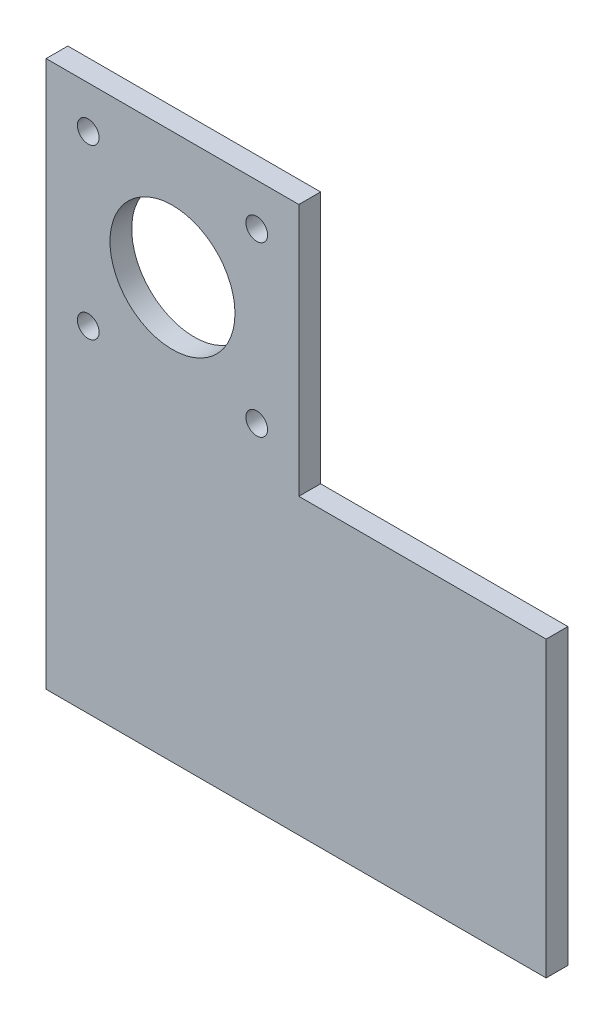
ISO-10303-21;
HEADER;
FILE_DESCRIPTION(('STEP AP214'),'2;1');
FILE_NAME('part.step','',(''),(''),'','','');
FILE_SCHEMA(('AUTOMOTIVE_DESIGN { 1 0 10303 214 1 1 1 1 }'));
ENDSEC;
DATA;
#1=APPLICATION_CONTEXT('core data for automotive mechanical design processes');
#2=APPLICATION_PROTOCOL_DEFINITION('international standard','automotive_design',2000,#1);
#3=PRODUCT_CONTEXT('',#1,'mechanical');
#4=PRODUCT('Part','Part','',(#3));
#5=PRODUCT_RELATED_PRODUCT_CATEGORY('part','',(#4));
#6=PRODUCT_DEFINITION_FORMATION('','',#4);
#7=PRODUCT_DEFINITION_CONTEXT('part definition',#1,'design');
#8=PRODUCT_DEFINITION('design','',#6,#7);
#9=PRODUCT_DEFINITION_SHAPE('','',#8);
#10=(LENGTH_UNIT() NAMED_UNIT(*) SI_UNIT(.MILLI.,.METRE.));
#11=(NAMED_UNIT(*) PLANE_ANGLE_UNIT() SI_UNIT($,.RADIAN.));
#12=(NAMED_UNIT(*) SI_UNIT($,.STERADIAN.) SOLID_ANGLE_UNIT());
#13=UNCERTAINTY_MEASURE_WITH_UNIT(LENGTH_MEASURE(1.E-05),#10,'distance_accuracy_value','');
#14=(GEOMETRIC_REPRESENTATION_CONTEXT(3) GLOBAL_UNCERTAINTY_ASSIGNED_CONTEXT((#13)) GLOBAL_UNIT_ASSIGNED_CONTEXT((#10,
#11,#12)) REPRESENTATION_CONTEXT('',''));
#15=CARTESIAN_POINT('',(0.,0.,0.));
#16=DIRECTION('',(0.,0.,1.));
#17=DIRECTION('',(1.,0.,0.));
#18=AXIS2_PLACEMENT_3D('',#15,#16,#17);
#19=CARTESIAN_POINT('',(0.,0.,4.));
#20=DIRECTION('',(0.,0.,-1.));
#21=DIRECTION('',(-1.,0.,0.));
#22=AXIS2_PLACEMENT_3D('',#19,#20,#21);
#23=PLANE('',#22);
#24=DIRECTION('',(1.,0.,0.));
#25=VECTOR('',#24,1.);
#26=CARTESIAN_POINT('',(92.,0.,4.));
#27=LINE('',#26,#25);
#28=CARTESIAN_POINT('',(0.,0.,4.));
#29=VERTEX_POINT('',#28);
#30=CARTESIAN_POINT('',(92.,0.,4.));
#31=VERTEX_POINT('',#30);
#32=EDGE_CURVE('E129',#29,#31,#27,.T.);
#33=ORIENTED_EDGE('',*,*,#32,.T.);
#34=DIRECTION('',(0.,1.,0.));
#35=VECTOR('',#34,1.);
#36=CARTESIAN_POINT('',(92.,54.,4.));
#37=LINE('',#36,#35);
#38=CARTESIAN_POINT('',(92.,54.,4.));
#39=VERTEX_POINT('',#38);
#40=EDGE_CURVE('E87',#31,#39,#37,.T.);
#41=ORIENTED_EDGE('',*,*,#40,.T.);
#42=DIRECTION('',(-1.,0.,0.));
#43=VECTOR('',#42,1.);
#44=CARTESIAN_POINT('',(46.5,54.,4.));
#45=LINE('',#44,#43);
#46=CARTESIAN_POINT('',(46.5,54.,4.));
#47=VERTEX_POINT('',#46);
#48=EDGE_CURVE('E100',#39,#47,#45,.T.);
#49=ORIENTED_EDGE('',*,*,#48,.T.);
#50=DIRECTION('',(0.,1.,0.));
#51=VECTOR('',#50,1.);
#52=CARTESIAN_POINT('',(46.5,100.5,4.));
#53=LINE('',#52,#51);
#54=CARTESIAN_POINT('',(46.5,100.5,4.));
#55=VERTEX_POINT('',#54);
#56=EDGE_CURVE('E94',#47,#55,#53,.T.);
#57=ORIENTED_EDGE('',*,*,#56,.T.);
#58=DIRECTION('',(-1.,0.,0.));
#59=VECTOR('',#58,1.);
#60=CARTESIAN_POINT('',(0.,100.5,4.));
#61=LINE('',#60,#59);
#62=CARTESIAN_POINT('',(0.,100.5,4.));
#63=VERTEX_POINT('',#62);
#64=EDGE_CURVE('E98',#55,#63,#61,.T.);
#65=ORIENTED_EDGE('',*,*,#64,.T.);
#66=DIRECTION('',(0.,-1.,0.));
#67=VECTOR('',#66,1.);
#68=CARTESIAN_POINT('',(0.,0.,4.));
#69=LINE('',#68,#67);
#70=EDGE_CURVE('E50',#63,#29,#69,.T.);
#71=ORIENTED_EDGE('',*,*,#70,.T.);
#72=EDGE_LOOP('',(#33,#41,#49,#57,#65,#71));
#73=FACE_BOUND('',#72,.T.);
#74=CARTESIAN_POINT('',(23.25,77.25,4.));
#75=DIRECTION('',(0.,0.,1.));
#76=DIRECTION('',(1.,0.,0.));
#77=AXIS2_PLACEMENT_3D('',#74,#75,#76);
#78=CIRCLE('',#77,11.5);
#79=CARTESIAN_POINT('',(34.75,77.25,4.));
#80=VERTEX_POINT('',#79);
#81=EDGE_CURVE('E122',#80,#80,#78,.T.);
#82=ORIENTED_EDGE('',*,*,#81,.F.);
#83=EDGE_LOOP('',(#82));
#84=FACE_BOUND('',#83,.T.);
#85=CARTESIAN_POINT('',(7.75000185391281,92.7499981460872,4.));
#86=DIRECTION('',(0.,0.,1.));
#87=DIRECTION('',(1.,0.,0.));
#88=AXIS2_PLACEMENT_3D('',#85,#86,#87);
#89=CIRCLE('',#88,2.);
#90=CARTESIAN_POINT('',(9.75000185391281,92.7499981460872,4.));
#91=VERTEX_POINT('',#90);
#92=EDGE_CURVE('E203',#91,#91,#89,.T.);
#93=ORIENTED_EDGE('',*,*,#92,.F.);
#94=EDGE_LOOP('',(#93));
#95=FACE_BOUND('',#94,.T.);
#96=CARTESIAN_POINT('',(38.7500018539128,92.7500018539128,4.));
#97=DIRECTION('',(0.,0.,1.));
#98=DIRECTION('',(1.,0.,0.));
#99=AXIS2_PLACEMENT_3D('',#96,#97,#98);
#100=CIRCLE('',#99,2.);
#101=CARTESIAN_POINT('',(40.7500018539128,92.7500018539128,4.));
#102=VERTEX_POINT('',#101);
#103=EDGE_CURVE('E197',#102,#102,#100,.T.);
#104=ORIENTED_EDGE('',*,*,#103,.F.);
#105=EDGE_LOOP('',(#104));
#106=FACE_BOUND('',#105,.T.);
#107=CARTESIAN_POINT('',(38.7499981460872,61.7500018539128,4.));
#108=DIRECTION('',(0.,0.,1.));
#109=DIRECTION('',(1.,0.,0.));
#110=AXIS2_PLACEMENT_3D('',#107,#108,#109);
#111=CIRCLE('',#110,2.);
#112=CARTESIAN_POINT('',(40.7499981460872,61.7500018539128,4.));
#113=VERTEX_POINT('',#112);
#114=EDGE_CURVE('E191',#113,#113,#111,.T.);
#115=ORIENTED_EDGE('',*,*,#114,.F.);
#116=EDGE_LOOP('',(#115));
#117=FACE_BOUND('',#116,.T.);
#118=CARTESIAN_POINT('',(7.74999814608723,61.7499981460872,4.));
#119=DIRECTION('',(0.,0.,1.));
#120=DIRECTION('',(1.,0.,0.));
#121=AXIS2_PLACEMENT_3D('',#118,#119,#120);
#122=CIRCLE('',#121,2.);
#123=CARTESIAN_POINT('',(9.74999814608723,61.7499981460872,4.));
#124=VERTEX_POINT('',#123);
#125=EDGE_CURVE('E182',#124,#124,#122,.T.);
#126=ORIENTED_EDGE('',*,*,#125,.F.);
#127=EDGE_LOOP('',(#126));
#128=FACE_BOUND('',#127,.T.);
#129=ADVANCED_FACE('F33',(#73,#84,#95,#106,#117,#128),#23,.F.);
#130=CARTESIAN_POINT('',(0.,0.,0.));
#131=DIRECTION('',(0.,0.,-1.));
#132=DIRECTION('',(-1.,0.,0.));
#133=AXIS2_PLACEMENT_3D('',#130,#131,#132);
#134=PLANE('',#133);
#135=CARTESIAN_POINT('',(38.7499981460872,61.7500018539128,0.));
#136=DIRECTION('',(0.,0.,1.));
#137=DIRECTION('',(1.,0.,0.));
#138=AXIS2_PLACEMENT_3D('',#135,#136,#137);
#139=CIRCLE('',#138,2.);
#140=CARTESIAN_POINT('',(40.7499981460872,61.7500018539128,0.));
#141=VERTEX_POINT('',#140);
#142=EDGE_CURVE('E188',#141,#141,#139,.T.);
#143=ORIENTED_EDGE('',*,*,#142,.T.);
#144=EDGE_LOOP('',(#143));
#145=FACE_BOUND('',#144,.T.);
#146=CARTESIAN_POINT('',(7.75000185391281,92.7499981460872,0.));
#147=DIRECTION('',(0.,0.,1.));
#148=DIRECTION('',(1.,0.,0.));
#149=AXIS2_PLACEMENT_3D('',#146,#147,#148);
#150=CIRCLE('',#149,2.);
#151=CARTESIAN_POINT('',(9.75000185391281,92.7499981460872,0.));
#152=VERTEX_POINT('',#151);
#153=EDGE_CURVE('E200',#152,#152,#150,.T.);
#154=ORIENTED_EDGE('',*,*,#153,.T.);
#155=EDGE_LOOP('',(#154));
#156=FACE_BOUND('',#155,.T.);
#157=DIRECTION('',(1.,0.,0.));
#158=VECTOR('',#157,1.);
#159=CARTESIAN_POINT('',(92.,0.,0.));
#160=LINE('',#159,#158);
#161=CARTESIAN_POINT('',(0.,0.,0.));
#162=VERTEX_POINT('',#161);
#163=CARTESIAN_POINT('',(92.,0.,0.));
#164=VERTEX_POINT('',#163);
#165=EDGE_CURVE('E118',#162,#164,#160,.T.);
#166=ORIENTED_EDGE('',*,*,#165,.F.);
#167=DIRECTION('',(0.,-1.,0.));
#168=VECTOR('',#167,1.);
#169=CARTESIAN_POINT('',(0.,0.,0.));
#170=LINE('',#169,#168);
#171=CARTESIAN_POINT('',(0.,100.5,0.));
#172=VERTEX_POINT('',#171);
#173=EDGE_CURVE('E79',#172,#162,#170,.T.);
#174=ORIENTED_EDGE('',*,*,#173,.F.);
#175=DIRECTION('',(-1.,0.,0.));
#176=VECTOR('',#175,1.);
#177=CARTESIAN_POINT('',(0.,100.5,0.));
#178=LINE('',#177,#176);
#179=CARTESIAN_POINT('',(46.5,100.5,0.));
#180=VERTEX_POINT('',#179);
#181=EDGE_CURVE('E73',#180,#172,#178,.T.);
#182=ORIENTED_EDGE('',*,*,#181,.F.);
#183=DIRECTION('',(0.,1.,0.));
#184=VECTOR('',#183,1.);
#185=CARTESIAN_POINT('',(46.5,100.5,0.));
#186=LINE('',#185,#184);
#187=CARTESIAN_POINT('',(46.5,54.,0.));
#188=VERTEX_POINT('',#187);
#189=EDGE_CURVE('E108',#188,#180,#186,.T.);
#190=ORIENTED_EDGE('',*,*,#189,.F.);
#191=DIRECTION('',(-1.,0.,0.));
#192=VECTOR('',#191,1.);
#193=CARTESIAN_POINT('',(46.5,54.,0.));
#194=LINE('',#193,#192);
#195=CARTESIAN_POINT('',(92.,54.,0.));
#196=VERTEX_POINT('',#195);
#197=EDGE_CURVE('E124',#196,#188,#194,.T.);
#198=ORIENTED_EDGE('',*,*,#197,.F.);
#199=DIRECTION('',(0.,1.,0.));
#200=VECTOR('',#199,1.);
#201=CARTESIAN_POINT('',(92.,54.,0.));
#202=LINE('',#201,#200);
#203=EDGE_CURVE('E121',#164,#196,#202,.T.);
#204=ORIENTED_EDGE('',*,*,#203,.F.);
#205=EDGE_LOOP('',(#166,#174,#182,#190,#198,#204));
#206=FACE_BOUND('',#205,.T.);
#207=CARTESIAN_POINT('',(23.25,77.25,0.));
#208=DIRECTION('',(0.,0.,1.));
#209=DIRECTION('',(1.,0.,0.));
#210=AXIS2_PLACEMENT_3D('',#207,#208,#209);
#211=CIRCLE('',#210,11.5);
#212=CARTESIAN_POINT('',(34.75,77.25,0.));
#213=VERTEX_POINT('',#212);
#214=EDGE_CURVE('E206',#213,#213,#211,.T.);
#215=ORIENTED_EDGE('',*,*,#214,.T.);
#216=EDGE_LOOP('',(#215));
#217=FACE_BOUND('',#216,.T.);
#218=CARTESIAN_POINT('',(38.7500018539128,92.7500018539128,0.));
#219=DIRECTION('',(0.,0.,1.));
#220=DIRECTION('',(1.,0.,0.));
#221=AXIS2_PLACEMENT_3D('',#218,#219,#220);
#222=CIRCLE('',#221,2.);
#223=CARTESIAN_POINT('',(40.7500018539128,92.7500018539128,0.));
#224=VERTEX_POINT('',#223);
#225=EDGE_CURVE('E194',#224,#224,#222,.T.);
#226=ORIENTED_EDGE('',*,*,#225,.T.);
#227=EDGE_LOOP('',(#226));
#228=FACE_BOUND('',#227,.T.);
#229=CARTESIAN_POINT('',(7.74999814608723,61.7499981460872,0.));
#230=DIRECTION('',(0.,0.,1.));
#231=DIRECTION('',(1.,0.,0.));
#232=AXIS2_PLACEMENT_3D('',#229,#230,#231);
#233=CIRCLE('',#232,2.);
#234=CARTESIAN_POINT('',(9.74999814608723,61.7499981460872,0.));
#235=VERTEX_POINT('',#234);
#236=EDGE_CURVE('E185',#235,#235,#233,.T.);
#237=ORIENTED_EDGE('',*,*,#236,.T.);
#238=EDGE_LOOP('',(#237));
#239=FACE_BOUND('',#238,.T.);
#240=ADVANCED_FACE('F138',(#145,#156,#206,#217,#228,#239),#134,.T.);
#241=CARTESIAN_POINT('',(92.,0.,4.));
#242=DIRECTION('',(0.,1.,0.));
#243=DIRECTION('',(-1.,0.,0.));
#244=AXIS2_PLACEMENT_3D('',#241,#242,#243);
#245=PLANE('',#244);
#246=ORIENTED_EDGE('',*,*,#165,.T.);
#247=DIRECTION('',(0.,0.,-1.));
#248=VECTOR('',#247,1.);
#249=CARTESIAN_POINT('',(92.,0.,4.));
#250=LINE('',#249,#248);
#251=EDGE_CURVE('E11',#31,#164,#250,.T.);
#252=ORIENTED_EDGE('',*,*,#251,.F.);
#253=ORIENTED_EDGE('',*,*,#32,.F.);
#254=DIRECTION('',(0.,0.,-1.));
#255=VECTOR('',#254,1.);
#256=CARTESIAN_POINT('',(0.,0.,4.));
#257=LINE('',#256,#255);
#258=EDGE_CURVE('E114',#29,#162,#257,.T.);
#259=ORIENTED_EDGE('',*,*,#258,.T.);
#260=EDGE_LOOP('',(#246,#252,#253,#259));
#261=FACE_BOUND('',#260,.T.);
#262=ADVANCED_FACE('F35',(#261),#245,.F.);
#263=CARTESIAN_POINT('',(92.,54.,4.));
#264=DIRECTION('',(-1.,0.,0.));
#265=DIRECTION('',(0.,0.,1.));
#266=AXIS2_PLACEMENT_3D('',#263,#264,#265);
#267=PLANE('',#266);
#268=ORIENTED_EDGE('',*,*,#203,.T.);
#269=DIRECTION('',(0.,0.,-1.));
#270=VECTOR('',#269,1.);
#271=CARTESIAN_POINT('',(92.,54.,4.));
#272=LINE('',#271,#270);
#273=EDGE_CURVE('E42',#39,#196,#272,.T.);
#274=ORIENTED_EDGE('',*,*,#273,.F.);
#275=ORIENTED_EDGE('',*,*,#40,.F.);
#276=ORIENTED_EDGE('',*,*,#251,.T.);
#277=EDGE_LOOP('',(#268,#274,#275,#276));
#278=FACE_BOUND('',#277,.T.);
#279=ADVANCED_FACE('F275',(#278),#267,.F.);
#280=CARTESIAN_POINT('',(46.5,54.,4.));
#281=DIRECTION('',(0.,-1.,0.));
#282=DIRECTION('',(1.,0.,0.));
#283=AXIS2_PLACEMENT_3D('',#280,#281,#282);
#284=PLANE('',#283);
#285=ORIENTED_EDGE('',*,*,#197,.T.);
#286=DIRECTION('',(0.,0.,-1.));
#287=VECTOR('',#286,1.);
#288=CARTESIAN_POINT('',(46.5,54.,4.));
#289=LINE('',#288,#287);
#290=EDGE_CURVE('E109',#47,#188,#289,.T.);
#291=ORIENTED_EDGE('',*,*,#290,.F.);
#292=ORIENTED_EDGE('',*,*,#48,.F.);
#293=ORIENTED_EDGE('',*,*,#273,.T.);
#294=EDGE_LOOP('',(#285,#291,#292,#293));
#295=FACE_BOUND('',#294,.T.);
#296=ADVANCED_FACE('F135',(#295),#284,.F.);
#297=CARTESIAN_POINT('',(46.5,100.5,4.));
#298=DIRECTION('',(-1.,0.,0.));
#299=DIRECTION('',(0.,-1.,0.));
#300=AXIS2_PLACEMENT_3D('',#297,#298,#299);
#301=PLANE('',#300);
#302=ORIENTED_EDGE('',*,*,#189,.T.);
#303=DIRECTION('',(0.,0.,-1.));
#304=VECTOR('',#303,1.);
#305=CARTESIAN_POINT('',(46.5,100.5,4.));
#306=LINE('',#305,#304);
#307=EDGE_CURVE('E105',#55,#180,#306,.T.);
#308=ORIENTED_EDGE('',*,*,#307,.F.);
#309=ORIENTED_EDGE('',*,*,#56,.F.);
#310=ORIENTED_EDGE('',*,*,#290,.T.);
#311=EDGE_LOOP('',(#302,#308,#309,#310));
#312=FACE_BOUND('',#311,.T.);
#313=ADVANCED_FACE('F106',(#312),#301,.F.);
#314=CARTESIAN_POINT('',(0.,100.5,4.));
#315=DIRECTION('',(0.,-1.,0.));
#316=DIRECTION('',(0.,0.,-1.));
#317=AXIS2_PLACEMENT_3D('',#314,#315,#316);
#318=PLANE('',#317);
#319=ORIENTED_EDGE('',*,*,#181,.T.);
#320=DIRECTION('',(0.,0.,-1.));
#321=VECTOR('',#320,1.);
#322=CARTESIAN_POINT('',(0.,100.5,4.));
#323=LINE('',#322,#321);
#324=EDGE_CURVE('E110',#63,#172,#323,.T.);
#325=ORIENTED_EDGE('',*,*,#324,.F.);
#326=ORIENTED_EDGE('',*,*,#64,.F.);
#327=ORIENTED_EDGE('',*,*,#307,.T.);
#328=EDGE_LOOP('',(#319,#325,#326,#327));
#329=FACE_BOUND('',#328,.T.);
#330=ADVANCED_FACE('F112',(#329),#318,.F.);
#331=CARTESIAN_POINT('',(0.,0.,4.));
#332=DIRECTION('',(1.,0.,0.));
#333=DIRECTION('',(0.,0.,-1.));
#334=AXIS2_PLACEMENT_3D('',#331,#332,#333);
#335=PLANE('',#334);
#336=ORIENTED_EDGE('',*,*,#173,.T.);
#337=ORIENTED_EDGE('',*,*,#258,.F.);
#338=ORIENTED_EDGE('',*,*,#70,.F.);
#339=ORIENTED_EDGE('',*,*,#324,.T.);
#340=EDGE_LOOP('',(#336,#337,#338,#339));
#341=FACE_BOUND('',#340,.T.);
#342=ADVANCED_FACE('F143',(#341),#335,.F.);
#343=CARTESIAN_POINT('',(23.25,77.25,4.));
#344=DIRECTION('',(0.,0.,-1.));
#345=DIRECTION('',(-1.,0.,0.));
#346=AXIS2_PLACEMENT_3D('',#343,#344,#345);
#347=CYLINDRICAL_SURFACE('',#346,11.5);
#348=ORIENTED_EDGE('',*,*,#81,.T.);
#349=EDGE_LOOP('',(#348));
#350=FACE_BOUND('',#349,.T.);
#351=ORIENTED_EDGE('',*,*,#214,.F.);
#352=EDGE_LOOP('',(#351));
#353=FACE_BOUND('',#352,.T.);
#354=ADVANCED_FACE('F145',(#350,#353),#347,.F.);
#355=CARTESIAN_POINT('',(7.75000185391281,92.7499981460872,4.));
#356=DIRECTION('',(0.,0.,-1.));
#357=DIRECTION('',(-1.,0.,0.));
#358=AXIS2_PLACEMENT_3D('',#355,#356,#357);
#359=CYLINDRICAL_SURFACE('',#358,2.);
#360=ORIENTED_EDGE('',*,*,#92,.T.);
#361=EDGE_LOOP('',(#360));
#362=FACE_BOUND('',#361,.T.);
#363=ORIENTED_EDGE('',*,*,#153,.F.);
#364=EDGE_LOOP('',(#363));
#365=FACE_BOUND('',#364,.T.);
#366=ADVANCED_FACE('F151',(#362,#365),#359,.F.);
#367=CARTESIAN_POINT('',(38.7500018539128,92.7500018539128,4.));
#368=DIRECTION('',(0.,0.,-1.));
#369=DIRECTION('',(-1.,0.,0.));
#370=AXIS2_PLACEMENT_3D('',#367,#368,#369);
#371=CYLINDRICAL_SURFACE('',#370,2.);
#372=ORIENTED_EDGE('',*,*,#103,.T.);
#373=EDGE_LOOP('',(#372));
#374=FACE_BOUND('',#373,.T.);
#375=ORIENTED_EDGE('',*,*,#225,.F.);
#376=EDGE_LOOP('',(#375));
#377=FACE_BOUND('',#376,.T.);
#378=ADVANCED_FACE('F165',(#374,#377),#371,.F.);
#379=CARTESIAN_POINT('',(38.7499981460872,61.7500018539128,4.));
#380=DIRECTION('',(0.,0.,-1.));
#381=DIRECTION('',(-1.,0.,0.));
#382=AXIS2_PLACEMENT_3D('',#379,#380,#381);
#383=CYLINDRICAL_SURFACE('',#382,2.);
#384=ORIENTED_EDGE('',*,*,#114,.T.);
#385=EDGE_LOOP('',(#384));
#386=FACE_BOUND('',#385,.T.);
#387=ORIENTED_EDGE('',*,*,#142,.F.);
#388=EDGE_LOOP('',(#387));
#389=FACE_BOUND('',#388,.T.);
#390=ADVANCED_FACE('F169',(#386,#389),#383,.F.);
#391=CARTESIAN_POINT('',(7.74999814608723,61.7499981460872,4.));
#392=DIRECTION('',(0.,0.,-1.));
#393=DIRECTION('',(-1.,0.,0.));
#394=AXIS2_PLACEMENT_3D('',#391,#392,#393);
#395=CYLINDRICAL_SURFACE('',#394,2.);
#396=ORIENTED_EDGE('',*,*,#125,.T.);
#397=EDGE_LOOP('',(#396));
#398=FACE_BOUND('',#397,.T.);
#399=ORIENTED_EDGE('',*,*,#236,.F.);
#400=EDGE_LOOP('',(#399));
#401=FACE_BOUND('',#400,.T.);
#402=ADVANCED_FACE('F173',(#398,#401),#395,.F.);
#403=CLOSED_SHELL('',(#129,#240,#262,#279,#296,#313,#330,#342,#354,#366,#378,#390,#402));
#404=MANIFOLD_SOLID_BREP('B2',#403);
#405=ADVANCED_BREP_SHAPE_REPRESENTATION('',(#18,#404),#14);
#406=SHAPE_DEFINITION_REPRESENTATION(#9,#405);
ENDSEC;
END-ISO-10303-21;
